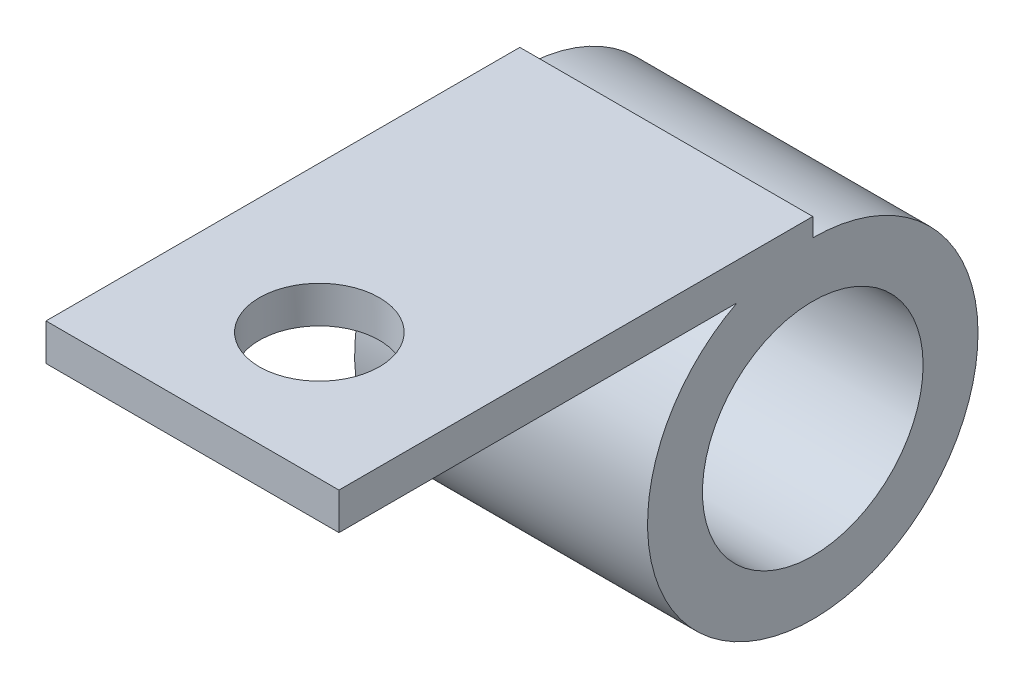
ISO-10303-21;
HEADER;
FILE_DESCRIPTION(('STEP AP214'),'2;1');
FILE_NAME('part.step','',(''),(''),'','','');
FILE_SCHEMA(('AUTOMOTIVE_DESIGN { 1 0 10303 214 1 1 1 1 }'));
ENDSEC;
DATA;
#1=APPLICATION_CONTEXT('core data for automotive mechanical design processes');
#2=APPLICATION_PROTOCOL_DEFINITION('international standard','automotive_design',2000,#1);
#3=PRODUCT_CONTEXT('',#1,'mechanical');
#4=PRODUCT('Part','Part','',(#3));
#5=PRODUCT_RELATED_PRODUCT_CATEGORY('part','',(#4));
#6=PRODUCT_DEFINITION_FORMATION('','',#4);
#7=PRODUCT_DEFINITION_CONTEXT('part definition',#1,'design');
#8=PRODUCT_DEFINITION('design','',#6,#7);
#9=PRODUCT_DEFINITION_SHAPE('','',#8);
#10=(LENGTH_UNIT() NAMED_UNIT(*) SI_UNIT(.MILLI.,.METRE.));
#11=(NAMED_UNIT(*) PLANE_ANGLE_UNIT() SI_UNIT($,.RADIAN.));
#12=(NAMED_UNIT(*) SI_UNIT($,.STERADIAN.) SOLID_ANGLE_UNIT());
#13=UNCERTAINTY_MEASURE_WITH_UNIT(LENGTH_MEASURE(1.E-05),#10,'distance_accuracy_value','');
#14=(GEOMETRIC_REPRESENTATION_CONTEXT(3) GLOBAL_UNCERTAINTY_ASSIGNED_CONTEXT((#13)) GLOBAL_UNIT_ASSIGNED_CONTEXT((#10,
#11,#12)) REPRESENTATION_CONTEXT('',''));
#15=CARTESIAN_POINT('',(0.,0.,0.));
#16=DIRECTION('',(0.,0.,1.));
#17=DIRECTION('',(1.,0.,0.));
#18=AXIS2_PLACEMENT_3D('',#15,#16,#17);
#19=CARTESIAN_POINT('',(6.35,0.,0.));
#20=DIRECTION('',(-1.,0.,0.));
#21=DIRECTION('',(0.,0.,1.));
#22=AXIS2_PLACEMENT_3D('',#19,#20,#21);
#23=CYLINDRICAL_SURFACE('',#22,7.1625);
#24=DIRECTION('',(-1.,0.,0.));
#25=VECTOR('',#24,1.);
#26=CARTESIAN_POINT('',(6.35,7.1625,0.));
#27=LINE('',#26,#25);
#28=CARTESIAN_POINT('',(6.35,7.1625,0.));
#29=VERTEX_POINT('',#28);
#30=CARTESIAN_POINT('',(-6.35,7.1625,0.));
#31=VERTEX_POINT('',#30);
#32=EDGE_CURVE('E11',#29,#31,#27,.T.);
#33=ORIENTED_EDGE('',*,*,#32,.F.);
#34=CARTESIAN_POINT('',(6.35,0.,0.));
#35=DIRECTION('',(1.,0.,0.));
#36=DIRECTION('',(0.,0.,-1.));
#37=AXIS2_PLACEMENT_3D('',#34,#35,#36);
#38=CIRCLE('',#37,7.1625);
#39=CARTESIAN_POINT('',(6.35,6.3625,3.2893768406797));
#40=VERTEX_POINT('',#39);
#41=EDGE_CURVE('E47',#40,#29,#38,.T.);
#42=ORIENTED_EDGE('',*,*,#41,.F.);
#43=DIRECTION('',(-1.,0.,0.));
#44=VECTOR('',#43,1.);
#45=CARTESIAN_POINT('',(6.35,6.3625,3.2893768406797));
#46=LINE('',#45,#44);
#47=CARTESIAN_POINT('',(-6.35,6.3625,3.2893768406797));
#48=VERTEX_POINT('',#47);
#49=EDGE_CURVE('E58',#48,#40,#46,.F.);
#50=ORIENTED_EDGE('',*,*,#49,.F.);
#51=CARTESIAN_POINT('',(-6.35,0.,0.));
#52=DIRECTION('',(1.,0.,0.));
#53=DIRECTION('',(0.,0.,-1.));
#54=AXIS2_PLACEMENT_3D('',#51,#52,#53);
#55=CIRCLE('',#54,7.1625);
#56=EDGE_CURVE('E108',#48,#31,#55,.T.);
#57=ORIENTED_EDGE('',*,*,#56,.T.);
#58=EDGE_LOOP('',(#33,#42,#50,#57));
#59=FACE_BOUND('',#58,.T.);
#60=ADVANCED_FACE('F41',(#59),#23,.T.);
#61=CARTESIAN_POINT('',(6.35,0.,0.));
#62=DIRECTION('',(1.,0.,0.));
#63=DIRECTION('',(0.,0.,-1.));
#64=AXIS2_PLACEMENT_3D('',#61,#62,#63);
#65=PLANE('',#64);
#66=CARTESIAN_POINT('',(6.35,0.,0.));
#67=DIRECTION('',(1.,0.,0.));
#68=DIRECTION('',(0.,0.,-1.));
#69=AXIS2_PLACEMENT_3D('',#66,#67,#68);
#70=CIRCLE('',#69,4.7825);
#71=CARTESIAN_POINT('',(6.35,0.,-4.7825));
#72=VERTEX_POINT('',#71);
#73=EDGE_CURVE('E120',#72,#72,#70,.T.);
#74=ORIENTED_EDGE('',*,*,#73,.F.);
#75=EDGE_LOOP('',(#74));
#76=FACE_BOUND('',#75,.T.);
#77=ORIENTED_EDGE('',*,*,#41,.T.);
#78=DIRECTION('',(0.,1.,0.));
#79=VECTOR('',#78,1.);
#80=CARTESIAN_POINT('',(6.35,7.9625,0.));
#81=LINE('',#80,#79);
#82=CARTESIAN_POINT('',(6.35,7.9625,0.));
#83=VERTEX_POINT('',#82);
#84=EDGE_CURVE('E83',#29,#83,#81,.T.);
#85=ORIENTED_EDGE('',*,*,#84,.T.);
#86=DIRECTION('',(0.,0.,1.));
#87=VECTOR('',#86,1.);
#88=CARTESIAN_POINT('',(6.35,7.9625,20.54));
#89=LINE('',#88,#87);
#90=CARTESIAN_POINT('',(6.35,7.9625,20.54));
#91=VERTEX_POINT('',#90);
#92=EDGE_CURVE('E86',#83,#91,#89,.T.);
#93=ORIENTED_EDGE('',*,*,#92,.T.);
#94=DIRECTION('',(0.,-1.,0.));
#95=VECTOR('',#94,1.);
#96=CARTESIAN_POINT('',(6.35,6.3625,20.54));
#97=LINE('',#96,#95);
#98=CARTESIAN_POINT('',(6.35,6.3625,20.54));
#99=VERTEX_POINT('',#98);
#100=EDGE_CURVE('E105',#91,#99,#97,.T.);
#101=ORIENTED_EDGE('',*,*,#100,.T.);
#102=DIRECTION('',(0.,0.,-1.));
#103=VECTOR('',#102,1.);
#104=CARTESIAN_POINT('',(6.35,6.3625,0.));
#105=LINE('',#104,#103);
#106=EDGE_CURVE('E132',#99,#40,#105,.T.);
#107=ORIENTED_EDGE('',*,*,#106,.T.);
#108=EDGE_LOOP('',(#77,#85,#93,#101,#107));
#109=FACE_BOUND('',#108,.T.);
#110=ADVANCED_FACE('F87',(#76,#109),#65,.T.);
#111=CARTESIAN_POINT('',(-6.35,0.,0.));
#112=DIRECTION('',(1.,0.,0.));
#113=DIRECTION('',(0.,0.,-1.));
#114=AXIS2_PLACEMENT_3D('',#111,#112,#113);
#115=PLANE('',#114);
#116=CARTESIAN_POINT('',(-6.35,0.,0.));
#117=DIRECTION('',(1.,0.,0.));
#118=DIRECTION('',(0.,0.,-1.));
#119=AXIS2_PLACEMENT_3D('',#116,#117,#118);
#120=CIRCLE('',#119,4.7825);
#121=CARTESIAN_POINT('',(-6.35,0.,-4.7825));
#122=VERTEX_POINT('',#121);
#123=EDGE_CURVE('E117',#122,#122,#120,.T.);
#124=ORIENTED_EDGE('',*,*,#123,.T.);
#125=EDGE_LOOP('',(#124));
#126=FACE_BOUND('',#125,.T.);
#127=ORIENTED_EDGE('',*,*,#56,.F.);
#128=DIRECTION('',(0.,0.,-1.));
#129=VECTOR('',#128,1.);
#130=CARTESIAN_POINT('',(-6.35,6.3625,0.));
#131=LINE('',#130,#129);
#132=CARTESIAN_POINT('',(-6.35,6.3625,20.54));
#133=VERTEX_POINT('',#132);
#134=EDGE_CURVE('E91',#133,#48,#131,.T.);
#135=ORIENTED_EDGE('',*,*,#134,.F.);
#136=DIRECTION('',(0.,-1.,0.));
#137=VECTOR('',#136,1.);
#138=CARTESIAN_POINT('',(-6.35,6.3625,20.54));
#139=LINE('',#138,#137);
#140=CARTESIAN_POINT('',(-6.35,7.9625,20.54));
#141=VERTEX_POINT('',#140);
#142=EDGE_CURVE('E137',#141,#133,#139,.T.);
#143=ORIENTED_EDGE('',*,*,#142,.F.);
#144=DIRECTION('',(0.,0.,1.));
#145=VECTOR('',#144,1.);
#146=CARTESIAN_POINT('',(-6.35,7.9625,20.54));
#147=LINE('',#146,#145);
#148=CARTESIAN_POINT('',(-6.35,7.9625,0.));
#149=VERTEX_POINT('',#148);
#150=EDGE_CURVE('E131',#149,#141,#147,.T.);
#151=ORIENTED_EDGE('',*,*,#150,.F.);
#152=DIRECTION('',(0.,1.,0.));
#153=VECTOR('',#152,1.);
#154=CARTESIAN_POINT('',(-6.35,7.9625,0.));
#155=LINE('',#154,#153);
#156=EDGE_CURVE('E106',#31,#149,#155,.T.);
#157=ORIENTED_EDGE('',*,*,#156,.F.);
#158=EDGE_LOOP('',(#127,#135,#143,#151,#157));
#159=FACE_BOUND('',#158,.T.);
#160=ADVANCED_FACE('F146',(#126,#159),#115,.F.);
#161=CARTESIAN_POINT('',(6.35,7.9625,0.));
#162=DIRECTION('',(0.,0.,1.));
#163=DIRECTION('',(1.,0.,0.));
#164=AXIS2_PLACEMENT_3D('',#161,#162,#163);
#165=PLANE('',#164);
#166=ORIENTED_EDGE('',*,*,#84,.F.);
#167=ORIENTED_EDGE('',*,*,#32,.T.);
#168=ORIENTED_EDGE('',*,*,#156,.T.);
#169=DIRECTION('',(-1.,0.,0.));
#170=VECTOR('',#169,1.);
#171=CARTESIAN_POINT('',(6.35,7.9625,0.));
#172=LINE('',#171,#170);
#173=EDGE_CURVE('E98',#83,#149,#172,.T.);
#174=ORIENTED_EDGE('',*,*,#173,.F.);
#175=EDGE_LOOP('',(#166,#167,#168,#174));
#176=FACE_BOUND('',#175,.T.);
#177=ADVANCED_FACE('F102',(#176),#165,.F.);
#178=CARTESIAN_POINT('',(6.35,6.3625,0.));
#179=DIRECTION('',(0.,1.,0.));
#180=DIRECTION('',(0.,0.,1.));
#181=AXIS2_PLACEMENT_3D('',#178,#179,#180);
#182=PLANE('',#181);
#183=CARTESIAN_POINT('',(0.,6.3625,15.04));
#184=DIRECTION('',(0.,1.,0.));
#185=DIRECTION('',(0.,0.,1.));
#186=AXIS2_PLACEMENT_3D('',#183,#184,#185);
#187=CIRCLE('',#186,2.6);
#188=CARTESIAN_POINT('',(0.,6.3625,17.64));
#189=VERTEX_POINT('',#188);
#190=EDGE_CURVE('E116',#189,#189,#187,.T.);
#191=ORIENTED_EDGE('',*,*,#190,.T.);
#192=EDGE_LOOP('',(#191));
#193=FACE_BOUND('',#192,.T.);
#194=ORIENTED_EDGE('',*,*,#134,.T.);
#195=ORIENTED_EDGE('',*,*,#49,.T.);
#196=ORIENTED_EDGE('',*,*,#106,.F.);
#197=DIRECTION('',(-1.,0.,0.));
#198=VECTOR('',#197,1.);
#199=CARTESIAN_POINT('',(6.35,6.3625,20.54));
#200=LINE('',#199,#198);
#201=EDGE_CURVE('E112',#99,#133,#200,.T.);
#202=ORIENTED_EDGE('',*,*,#201,.T.);
#203=EDGE_LOOP('',(#194,#195,#196,#202));
#204=FACE_BOUND('',#203,.T.);
#205=ADVANCED_FACE('F145',(#193,#204),#182,.F.);
#206=CARTESIAN_POINT('',(6.35,7.9625,20.54));
#207=DIRECTION('',(0.,-1.,0.));
#208=DIRECTION('',(0.,0.,-1.));
#209=AXIS2_PLACEMENT_3D('',#206,#207,#208);
#210=PLANE('',#209);
#211=CARTESIAN_POINT('',(0.,7.9625,15.04));
#212=DIRECTION('',(0.,-1.,0.));
#213=DIRECTION('',(0.,0.,-1.));
#214=AXIS2_PLACEMENT_3D('',#211,#212,#213);
#215=CIRCLE('',#214,2.6);
#216=CARTESIAN_POINT('',(0.,7.9625,12.44));
#217=VERTEX_POINT('',#216);
#218=EDGE_CURVE('E42',#217,#217,#215,.T.);
#219=ORIENTED_EDGE('',*,*,#218,.T.);
#220=EDGE_LOOP('',(#219));
#221=FACE_BOUND('',#220,.T.);
#222=ORIENTED_EDGE('',*,*,#150,.T.);
#223=DIRECTION('',(-1.,0.,0.));
#224=VECTOR('',#223,1.);
#225=CARTESIAN_POINT('',(6.35,7.9625,20.54));
#226=LINE('',#225,#224);
#227=EDGE_CURVE('E99',#91,#141,#226,.T.);
#228=ORIENTED_EDGE('',*,*,#227,.F.);
#229=ORIENTED_EDGE('',*,*,#92,.F.);
#230=ORIENTED_EDGE('',*,*,#173,.T.);
#231=EDGE_LOOP('',(#222,#228,#229,#230));
#232=FACE_BOUND('',#231,.T.);
#233=ADVANCED_FACE('F100',(#221,#232),#210,.F.);
#234=CARTESIAN_POINT('',(6.35,6.3625,20.54));
#235=DIRECTION('',(0.,0.,-1.));
#236=DIRECTION('',(-1.,0.,0.));
#237=AXIS2_PLACEMENT_3D('',#234,#235,#236);
#238=PLANE('',#237);
#239=ORIENTED_EDGE('',*,*,#142,.T.);
#240=ORIENTED_EDGE('',*,*,#201,.F.);
#241=ORIENTED_EDGE('',*,*,#100,.F.);
#242=ORIENTED_EDGE('',*,*,#227,.T.);
#243=EDGE_LOOP('',(#239,#240,#241,#242));
#244=FACE_BOUND('',#243,.T.);
#245=ADVANCED_FACE('F164',(#244),#238,.F.);
#246=CARTESIAN_POINT('',(-7.35,0.,0.));
#247=DIRECTION('',(1.,0.,0.));
#248=DIRECTION('',(0.,0.,-1.));
#249=AXIS2_PLACEMENT_3D('',#246,#247,#248);
#250=CYLINDRICAL_SURFACE('',#249,4.7825);
#251=ORIENTED_EDGE('',*,*,#73,.T.);
#252=EDGE_LOOP('',(#251));
#253=FACE_BOUND('',#252,.T.);
#254=ORIENTED_EDGE('',*,*,#123,.F.);
#255=EDGE_LOOP('',(#254));
#256=FACE_BOUND('',#255,.T.);
#257=ADVANCED_FACE('F169',(#253,#256),#250,.F.);
#258=CARTESIAN_POINT('',(0.,-20.,15.04));
#259=DIRECTION('',(0.,1.,0.));
#260=DIRECTION('',(0.,0.,1.));
#261=AXIS2_PLACEMENT_3D('',#258,#259,#260);
#262=CYLINDRICAL_SURFACE('',#261,2.6);
#263=ORIENTED_EDGE('',*,*,#218,.F.);
#264=EDGE_LOOP('',(#263));
#265=FACE_BOUND('',#264,.T.);
#266=ORIENTED_EDGE('',*,*,#190,.F.);
#267=EDGE_LOOP('',(#266));
#268=FACE_BOUND('',#267,.T.);
#269=ADVANCED_FACE('F175',(#265,#268),#262,.F.);
#270=CLOSED_SHELL('',(#60,#110,#160,#177,#205,#233,#245,#257,#269));
#271=MANIFOLD_SOLID_BREP('B2',#270);
#272=ADVANCED_BREP_SHAPE_REPRESENTATION('',(#18,#271),#14);
#273=SHAPE_DEFINITION_REPRESENTATION(#9,#272);
ENDSEC;
END-ISO-10303-21;
